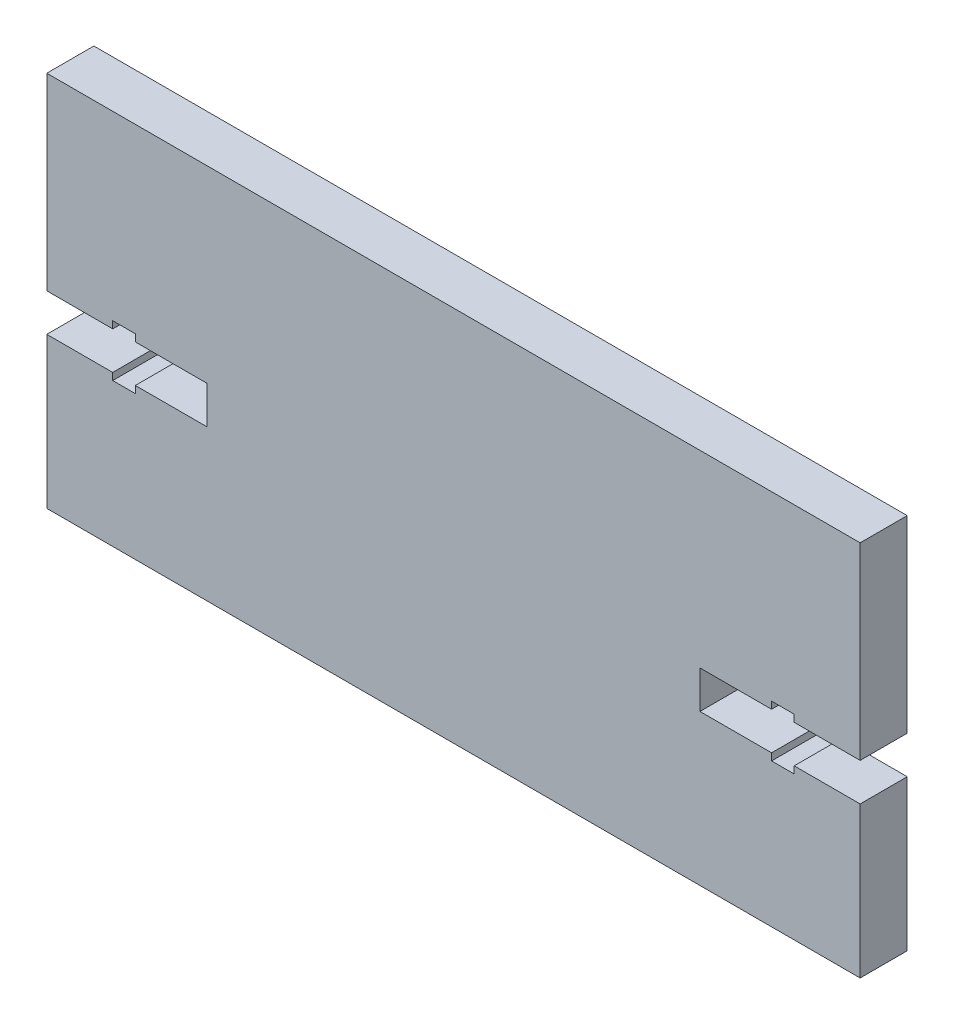
ISO-10303-21;
HEADER;
FILE_DESCRIPTION(('STEP AP214'),'2;1');
FILE_NAME('part.step','',(''),(''),'','','');
FILE_SCHEMA(('AUTOMOTIVE_DESIGN { 1 0 10303 214 1 1 1 1 }'));
ENDSEC;
DATA;
#1=APPLICATION_CONTEXT('core data for automotive mechanical design processes');
#2=APPLICATION_PROTOCOL_DEFINITION('international standard','automotive_design',2000,#1);
#3=PRODUCT_CONTEXT('',#1,'mechanical');
#4=PRODUCT('Part','Part','',(#3));
#5=PRODUCT_RELATED_PRODUCT_CATEGORY('part','',(#4));
#6=PRODUCT_DEFINITION_FORMATION('','',#4);
#7=PRODUCT_DEFINITION_CONTEXT('part definition',#1,'design');
#8=PRODUCT_DEFINITION('design','',#6,#7);
#9=PRODUCT_DEFINITION_SHAPE('','',#8);
#10=(LENGTH_UNIT() NAMED_UNIT(*) SI_UNIT(.MILLI.,.METRE.));
#11=(NAMED_UNIT(*) PLANE_ANGLE_UNIT() SI_UNIT($,.RADIAN.));
#12=(NAMED_UNIT(*) SI_UNIT($,.STERADIAN.) SOLID_ANGLE_UNIT());
#13=UNCERTAINTY_MEASURE_WITH_UNIT(LENGTH_MEASURE(1.E-05),#10,'distance_accuracy_value','');
#14=(GEOMETRIC_REPRESENTATION_CONTEXT(3) GLOBAL_UNCERTAINTY_ASSIGNED_CONTEXT((#13)) GLOBAL_UNIT_ASSIGNED_CONTEXT((#10,
#11,#12)) REPRESENTATION_CONTEXT('',''));
#15=CARTESIAN_POINT('',(0.,0.,0.));
#16=DIRECTION('',(0.,0.,1.));
#17=DIRECTION('',(1.,0.,0.));
#18=AXIS2_PLACEMENT_3D('',#15,#16,#17);
#19=CARTESIAN_POINT('',(-34.7185538966779,10.5285496749878,5.));
#20=DIRECTION('',(1.,0.,0.));
#21=DIRECTION('',(0.,1.,0.));
#22=AXIS2_PLACEMENT_3D('',#19,#20,#21);
#23=PLANE('',#22);
#24=DIRECTION('',(0.,-1.,0.));
#25=VECTOR('',#24,1.);
#26=CARTESIAN_POINT('',(-34.7185538966779,10.5285496749878,0.));
#27=LINE('',#26,#25);
#28=CARTESIAN_POINT('',(-34.7185538966779,10.5285496749878,0.));
#29=VERTEX_POINT('',#28);
#30=CARTESIAN_POINT('',(-34.7185538966779,-9.47145032501215,0.));
#31=VERTEX_POINT('',#30);
#32=EDGE_CURVE('E401',#29,#31,#27,.T.);
#33=ORIENTED_EDGE('',*,*,#32,.T.);
#34=DIRECTION('',(0.,0.,-1.));
#35=VECTOR('',#34,1.);
#36=CARTESIAN_POINT('',(-34.7185538966779,-9.47145032501215,10.));
#37=LINE('',#36,#35);
#38=CARTESIAN_POINT('',(-34.7185538966779,-9.47145032501215,5.));
#39=VERTEX_POINT('',#38);
#40=EDGE_CURVE('E236',#39,#31,#37,.T.);
#41=ORIENTED_EDGE('',*,*,#40,.F.);
#42=DIRECTION('',(0.,-1.,0.));
#43=VECTOR('',#42,1.);
#44=CARTESIAN_POINT('',(-34.7185538966779,10.5285496749878,5.));
#45=LINE('',#44,#43);
#46=CARTESIAN_POINT('',(-34.7185538966779,10.5285496749878,5.));
#47=VERTEX_POINT('',#46);
#48=EDGE_CURVE('E388',#47,#39,#45,.T.);
#49=ORIENTED_EDGE('',*,*,#48,.F.);
#50=DIRECTION('',(0.,0.,-1.));
#51=VECTOR('',#50,1.);
#52=CARTESIAN_POINT('',(-34.7185538966779,10.5285496749878,5.));
#53=LINE('',#52,#51);
#54=EDGE_CURVE('E400',#47,#29,#53,.T.);
#55=ORIENTED_EDGE('',*,*,#54,.T.);
#56=EDGE_LOOP('',(#33,#41,#49,#55));
#57=FACE_BOUND('',#56,.T.);
#58=ADVANCED_FACE('F33',(#57),#23,.F.);
#59=CARTESIAN_POINT('',(51.6079265333221,10.5285496749878,5.));
#60=DIRECTION('',(-1.,0.,0.));
#61=DIRECTION('',(0.,-1.,0.));
#62=AXIS2_PLACEMENT_3D('',#59,#60,#61);
#63=PLANE('',#62);
#64=DIRECTION('',(0.,1.,0.));
#65=VECTOR('',#64,1.);
#66=CARTESIAN_POINT('',(51.6079265333221,10.5285496749878,5.));
#67=LINE('',#66,#65);
#68=CARTESIAN_POINT('',(51.6079265333222,-9.47145032501216,5.));
#69=VERTEX_POINT('',#68);
#70=CARTESIAN_POINT('',(51.6079265333221,10.5285496749878,5.));
#71=VERTEX_POINT('',#70);
#72=EDGE_CURVE('E394',#69,#71,#67,.T.);
#73=ORIENTED_EDGE('',*,*,#72,.F.);
#74=DIRECTION('',(0.,0.,-1.));
#75=VECTOR('',#74,1.);
#76=CARTESIAN_POINT('',(51.6079265333222,-9.47145032501216,10.));
#77=LINE('',#76,#75);
#78=CARTESIAN_POINT('',(51.6079265333222,-9.47145032501216,0.));
#79=VERTEX_POINT('',#78);
#80=EDGE_CURVE('E269',#69,#79,#77,.T.);
#81=ORIENTED_EDGE('',*,*,#80,.T.);
#82=DIRECTION('',(0.,1.,0.));
#83=VECTOR('',#82,1.);
#84=CARTESIAN_POINT('',(51.6079265333221,10.5285496749878,0.));
#85=LINE('',#84,#83);
#86=CARTESIAN_POINT('',(51.6079265333221,10.5285496749878,0.));
#87=VERTEX_POINT('',#86);
#88=EDGE_CURVE('E406',#79,#87,#85,.T.);
#89=ORIENTED_EDGE('',*,*,#88,.T.);
#90=DIRECTION('',(0.,0.,-1.));
#91=VECTOR('',#90,1.);
#92=CARTESIAN_POINT('',(51.6079265333221,10.5285496749878,5.));
#93=LINE('',#92,#91);
#94=EDGE_CURVE('E413',#71,#87,#93,.T.);
#95=ORIENTED_EDGE('',*,*,#94,.F.);
#96=EDGE_LOOP('',(#73,#81,#89,#95));
#97=FACE_BOUND('',#96,.T.);
#98=ADVANCED_FACE('F495',(#97),#63,.F.);
#99=CARTESIAN_POINT('',(-34.7185538966779,-13.4714503250122,5.));
#100=VERTEX_POINT('',#99);
#101=CARTESIAN_POINT('',(-34.7185538966779,-29.4714503250121,5.));
#102=VERTEX_POINT('',#101);
#103=EDGE_CURVE('E392',#100,#102,#45,.T.);
#104=ORIENTED_EDGE('',*,*,#103,.F.);
#105=DIRECTION('',(0.,0.,-1.));
#106=VECTOR('',#105,1.);
#107=CARTESIAN_POINT('',(-34.7185538966779,-13.4714503250122,10.));
#108=LINE('',#107,#106);
#109=CARTESIAN_POINT('',(-34.7185538966779,-13.4714503250122,0.));
#110=VERTEX_POINT('',#109);
#111=EDGE_CURVE('E323',#100,#110,#108,.T.);
#112=ORIENTED_EDGE('',*,*,#111,.T.);
#113=CARTESIAN_POINT('',(-34.7185538966779,-29.4714503250121,0.));
#114=VERTEX_POINT('',#113);
#115=EDGE_CURVE('E387',#110,#114,#27,.T.);
#116=ORIENTED_EDGE('',*,*,#115,.T.);
#117=DIRECTION('',(0.,0.,-1.));
#118=VECTOR('',#117,1.);
#119=CARTESIAN_POINT('',(-34.7185538966779,-29.4714503250121,5.));
#120=LINE('',#119,#118);
#121=EDGE_CURVE('E11',#102,#114,#120,.T.);
#122=ORIENTED_EDGE('',*,*,#121,.F.);
#123=EDGE_LOOP('',(#104,#112,#116,#122));
#124=FACE_BOUND('',#123,.T.);
#125=ADVANCED_FACE('F35',(#124),#23,.F.);
#126=CARTESIAN_POINT('',(-34.7185538966779,-29.4714503250121,5.));
#127=DIRECTION('',(0.,1.,0.));
#128=DIRECTION('',(0.,0.,1.));
#129=AXIS2_PLACEMENT_3D('',#126,#127,#128);
#130=PLANE('',#129);
#131=DIRECTION('',(1.,0.,0.));
#132=VECTOR('',#131,1.);
#133=CARTESIAN_POINT('',(-34.7185538966779,-29.4714503250121,0.));
#134=LINE('',#133,#132);
#135=CARTESIAN_POINT('',(51.6079265333221,-29.4714503250121,0.));
#136=VERTEX_POINT('',#135);
#137=EDGE_CURVE('E404',#114,#136,#134,.T.);
#138=ORIENTED_EDGE('',*,*,#137,.T.);
#139=DIRECTION('',(0.,0.,-1.));
#140=VECTOR('',#139,1.);
#141=CARTESIAN_POINT('',(51.6079265333221,-29.4714503250121,5.));
#142=LINE('',#141,#140);
#143=CARTESIAN_POINT('',(51.6079265333221,-29.4714503250121,5.));
#144=VERTEX_POINT('',#143);
#145=EDGE_CURVE('E41',#144,#136,#142,.T.);
#146=ORIENTED_EDGE('',*,*,#145,.F.);
#147=DIRECTION('',(1.,0.,0.));
#148=VECTOR('',#147,1.);
#149=CARTESIAN_POINT('',(-34.7185538966779,-29.4714503250121,5.));
#150=LINE('',#149,#148);
#151=EDGE_CURVE('E391',#102,#144,#150,.T.);
#152=ORIENTED_EDGE('',*,*,#151,.F.);
#153=ORIENTED_EDGE('',*,*,#121,.T.);
#154=EDGE_LOOP('',(#138,#146,#152,#153));
#155=FACE_BOUND('',#154,.T.);
#156=ADVANCED_FACE('F426',(#155),#130,.F.);
#157=CARTESIAN_POINT('',(51.6079265333221,-13.4714503250122,0.));
#158=VERTEX_POINT('',#157);
#159=EDGE_CURVE('E407',#136,#158,#85,.T.);
#160=ORIENTED_EDGE('',*,*,#159,.T.);
#161=DIRECTION('',(0.,0.,-1.));
#162=VECTOR('',#161,1.);
#163=CARTESIAN_POINT('',(51.6079265333222,-13.4714503250122,10.));
#164=LINE('',#163,#162);
#165=CARTESIAN_POINT('',(51.6079265333222,-13.4714503250122,5.));
#166=VERTEX_POINT('',#165);
#167=EDGE_CURVE('E56',#166,#158,#164,.T.);
#168=ORIENTED_EDGE('',*,*,#167,.F.);
#169=EDGE_CURVE('E395',#144,#166,#67,.T.);
#170=ORIENTED_EDGE('',*,*,#169,.F.);
#171=ORIENTED_EDGE('',*,*,#145,.T.);
#172=EDGE_LOOP('',(#160,#168,#170,#171));
#173=FACE_BOUND('',#172,.T.);
#174=ADVANCED_FACE('F419',(#173),#63,.F.);
#175=CARTESIAN_POINT('',(-34.7185538966779,10.5285496749878,5.));
#176=DIRECTION('',(0.,-1.,0.));
#177=DIRECTION('',(0.,0.,-1.));
#178=AXIS2_PLACEMENT_3D('',#175,#176,#177);
#179=PLANE('',#178);
#180=DIRECTION('',(-1.,0.,0.));
#181=VECTOR('',#180,1.);
#182=CARTESIAN_POINT('',(-34.7185538966779,10.5285496749878,0.));
#183=LINE('',#182,#181);
#184=EDGE_CURVE('E409',#87,#29,#183,.T.);
#185=ORIENTED_EDGE('',*,*,#184,.T.);
#186=ORIENTED_EDGE('',*,*,#54,.F.);
#187=DIRECTION('',(-1.,0.,0.));
#188=VECTOR('',#187,1.);
#189=CARTESIAN_POINT('',(-34.7185538966779,10.5285496749878,5.));
#190=LINE('',#189,#188);
#191=EDGE_CURVE('E398',#71,#47,#190,.T.);
#192=ORIENTED_EDGE('',*,*,#191,.F.);
#193=ORIENTED_EDGE('',*,*,#94,.T.);
#194=EDGE_LOOP('',(#185,#186,#192,#193));
#195=FACE_BOUND('',#194,.T.);
#196=ADVANCED_FACE('F491',(#195),#179,.F.);
#197=CARTESIAN_POINT('',(0.,0.,5.));
#198=DIRECTION('',(0.,0.,1.));
#199=DIRECTION('',(1.,0.,0.));
#200=AXIS2_PLACEMENT_3D('',#197,#198,#199);
#201=PLANE('',#200);
#202=DIRECTION('',(-1.,0.,0.));
#203=VECTOR('',#202,1.);
#204=CARTESIAN_POINT('',(0.,-9.47145032501216,5.));
#205=LINE('',#204,#203);
#206=CARTESIAN_POINT('',(44.6079265333222,-9.47145032501216,5.));
#207=VERTEX_POINT('',#206);
#208=EDGE_CURVE('E385',#69,#207,#205,.T.);
#209=ORIENTED_EDGE('',*,*,#208,.F.);
#210=ORIENTED_EDGE('',*,*,#72,.T.);
#211=ORIENTED_EDGE('',*,*,#191,.T.);
#212=ORIENTED_EDGE('',*,*,#48,.T.);
#213=DIRECTION('',(-1.,0.,0.));
#214=VECTOR('',#213,1.);
#215=CARTESIAN_POINT('',(0.,-9.47145032501216,5.));
#216=LINE('',#215,#214);
#217=CARTESIAN_POINT('',(-27.7185538966779,-9.47145032501215,5.));
#218=VERTEX_POINT('',#217);
#219=EDGE_CURVE('E364',#218,#39,#216,.T.);
#220=ORIENTED_EDGE('',*,*,#219,.F.);
#221=DIRECTION('',(0.,-1.,0.));
#222=VECTOR('',#221,1.);
#223=CARTESIAN_POINT('',(-27.7185538966779,0.,5.));
#224=LINE('',#223,#222);
#225=CARTESIAN_POINT('',(-27.7185538966779,-8.72145032501215,5.));
#226=VERTEX_POINT('',#225);
#227=EDGE_CURVE('E272',#226,#218,#224,.T.);
#228=ORIENTED_EDGE('',*,*,#227,.F.);
#229=DIRECTION('',(-1.,0.,0.));
#230=VECTOR('',#229,1.);
#231=CARTESIAN_POINT('',(0.,-8.72145032501215,5.));
#232=LINE('',#231,#230);
#233=CARTESIAN_POINT('',(-25.3185538966779,-8.72145032501215,5.));
#234=VERTEX_POINT('',#233);
#235=EDGE_CURVE('E346',#234,#226,#232,.T.);
#236=ORIENTED_EDGE('',*,*,#235,.F.);
#237=DIRECTION('',(0.,1.,0.));
#238=VECTOR('',#237,1.);
#239=CARTESIAN_POINT('',(-25.3185538966779,0.,5.));
#240=LINE('',#239,#238);
#241=CARTESIAN_POINT('',(-25.3185538966779,-9.47145032501215,5.));
#242=VERTEX_POINT('',#241);
#243=EDGE_CURVE('E348',#242,#234,#240,.T.);
#244=ORIENTED_EDGE('',*,*,#243,.F.);
#245=DIRECTION('',(-1.,0.,0.));
#246=VECTOR('',#245,1.);
#247=CARTESIAN_POINT('',(0.,-9.47145032501215,5.));
#248=LINE('',#247,#246);
#249=CARTESIAN_POINT('',(-17.718553896678,-9.47145032501215,5.));
#250=VERTEX_POINT('',#249);
#251=EDGE_CURVE('E350',#250,#242,#248,.T.);
#252=ORIENTED_EDGE('',*,*,#251,.F.);
#253=DIRECTION('',(0.,1.,0.));
#254=VECTOR('',#253,1.);
#255=CARTESIAN_POINT('',(-17.718553896678,0.,5.));
#256=LINE('',#255,#254);
#257=CARTESIAN_POINT('',(-17.718553896678,-13.4714503250122,5.));
#258=VERTEX_POINT('',#257);
#259=EDGE_CURVE('E352',#258,#250,#256,.T.);
#260=ORIENTED_EDGE('',*,*,#259,.F.);
#261=DIRECTION('',(1.,0.,0.));
#262=VECTOR('',#261,1.);
#263=CARTESIAN_POINT('',(0.,-13.4714503250122,5.));
#264=LINE('',#263,#262);
#265=CARTESIAN_POINT('',(-25.318553896678,-13.4714503250122,5.));
#266=VERTEX_POINT('',#265);
#267=EDGE_CURVE('E354',#266,#258,#264,.T.);
#268=ORIENTED_EDGE('',*,*,#267,.F.);
#269=DIRECTION('',(0.,1.,0.));
#270=VECTOR('',#269,1.);
#271=CARTESIAN_POINT('',(-25.318553896678,0.,5.));
#272=LINE('',#271,#270);
#273=CARTESIAN_POINT('',(-25.318553896678,-14.2214503250122,5.));
#274=VERTEX_POINT('',#273);
#275=EDGE_CURVE('E356',#274,#266,#272,.T.);
#276=ORIENTED_EDGE('',*,*,#275,.F.);
#277=DIRECTION('',(1.,0.,0.));
#278=VECTOR('',#277,1.);
#279=CARTESIAN_POINT('',(0.,-14.2214503250122,5.));
#280=LINE('',#279,#278);
#281=CARTESIAN_POINT('',(-27.718553896678,-14.2214503250122,5.));
#282=VERTEX_POINT('',#281);
#283=EDGE_CURVE('E358',#282,#274,#280,.T.);
#284=ORIENTED_EDGE('',*,*,#283,.F.);
#285=DIRECTION('',(0.,-1.,0.));
#286=VECTOR('',#285,1.);
#287=CARTESIAN_POINT('',(-27.718553896678,0.,5.));
#288=LINE('',#287,#286);
#289=CARTESIAN_POINT('',(-27.718553896678,-13.4714503250122,5.));
#290=VERTEX_POINT('',#289);
#291=EDGE_CURVE('E360',#290,#282,#288,.T.);
#292=ORIENTED_EDGE('',*,*,#291,.F.);
#293=DIRECTION('',(1.,0.,0.));
#294=VECTOR('',#293,1.);
#295=CARTESIAN_POINT('',(0.,-13.4714503250122,5.));
#296=LINE('',#295,#294);
#297=EDGE_CURVE('E362',#100,#290,#296,.T.);
#298=ORIENTED_EDGE('',*,*,#297,.F.);
#299=ORIENTED_EDGE('',*,*,#103,.T.);
#300=ORIENTED_EDGE('',*,*,#151,.T.);
#301=ORIENTED_EDGE('',*,*,#169,.T.);
#302=DIRECTION('',(1.,0.,0.));
#303=VECTOR('',#302,1.);
#304=CARTESIAN_POINT('',(0.,-13.4714503250122,5.));
#305=LINE('',#304,#303);
#306=CARTESIAN_POINT('',(44.6079265333222,-13.4714503250122,5.));
#307=VERTEX_POINT('',#306);
#308=EDGE_CURVE('E366',#307,#166,#305,.T.);
#309=ORIENTED_EDGE('',*,*,#308,.F.);
#310=DIRECTION('',(0.,1.,0.));
#311=VECTOR('',#310,1.);
#312=CARTESIAN_POINT('',(44.6079265333222,0.,5.));
#313=LINE('',#312,#311);
#314=CARTESIAN_POINT('',(44.6079265333222,-14.2214503250122,5.));
#315=VERTEX_POINT('',#314);
#316=EDGE_CURVE('E227',#315,#307,#313,.T.);
#317=ORIENTED_EDGE('',*,*,#316,.F.);
#318=DIRECTION('',(1.,0.,0.));
#319=VECTOR('',#318,1.);
#320=CARTESIAN_POINT('',(0.,-14.2214503250122,5.));
#321=LINE('',#320,#319);
#322=CARTESIAN_POINT('',(42.2079265333222,-14.2214503250122,5.));
#323=VERTEX_POINT('',#322);
#324=EDGE_CURVE('E369',#323,#315,#321,.T.);
#325=ORIENTED_EDGE('',*,*,#324,.F.);
#326=DIRECTION('',(0.,-1.,0.));
#327=VECTOR('',#326,1.);
#328=CARTESIAN_POINT('',(42.2079265333222,0.,5.));
#329=LINE('',#328,#327);
#330=CARTESIAN_POINT('',(42.2079265333222,-13.4714503250122,5.));
#331=VERTEX_POINT('',#330);
#332=EDGE_CURVE('E371',#331,#323,#329,.T.);
#333=ORIENTED_EDGE('',*,*,#332,.F.);
#334=DIRECTION('',(1.,0.,0.));
#335=VECTOR('',#334,1.);
#336=CARTESIAN_POINT('',(0.,-13.4714503250122,5.));
#337=LINE('',#336,#335);
#338=CARTESIAN_POINT('',(34.6079265333222,-13.4714503250122,5.));
#339=VERTEX_POINT('',#338);
#340=EDGE_CURVE('E373',#339,#331,#337,.T.);
#341=ORIENTED_EDGE('',*,*,#340,.F.);
#342=DIRECTION('',(0.,-1.,0.));
#343=VECTOR('',#342,1.);
#344=CARTESIAN_POINT('',(34.6079265333222,0.,5.));
#345=LINE('',#344,#343);
#346=CARTESIAN_POINT('',(34.6079265333222,-9.47145032501216,5.));
#347=VERTEX_POINT('',#346);
#348=EDGE_CURVE('E375',#347,#339,#345,.T.);
#349=ORIENTED_EDGE('',*,*,#348,.F.);
#350=DIRECTION('',(-1.,0.,0.));
#351=VECTOR('',#350,1.);
#352=CARTESIAN_POINT('',(0.,-9.47145032501215,5.));
#353=LINE('',#352,#351);
#354=CARTESIAN_POINT('',(42.2079265333222,-9.47145032501216,5.));
#355=VERTEX_POINT('',#354);
#356=EDGE_CURVE('E377',#355,#347,#353,.T.);
#357=ORIENTED_EDGE('',*,*,#356,.F.);
#358=DIRECTION('',(0.,-1.,0.));
#359=VECTOR('',#358,1.);
#360=CARTESIAN_POINT('',(42.2079265333222,0.,5.));
#361=LINE('',#360,#359);
#362=CARTESIAN_POINT('',(42.2079265333222,-8.72145032501216,5.));
#363=VERTEX_POINT('',#362);
#364=EDGE_CURVE('E379',#363,#355,#361,.T.);
#365=ORIENTED_EDGE('',*,*,#364,.F.);
#366=DIRECTION('',(-1.,0.,0.));
#367=VECTOR('',#366,1.);
#368=CARTESIAN_POINT('',(0.,-8.72145032501216,5.));
#369=LINE('',#368,#367);
#370=CARTESIAN_POINT('',(44.6079265333222,-8.72145032501216,5.));
#371=VERTEX_POINT('',#370);
#372=EDGE_CURVE('E381',#371,#363,#369,.T.);
#373=ORIENTED_EDGE('',*,*,#372,.F.);
#374=DIRECTION('',(0.,1.,0.));
#375=VECTOR('',#374,1.);
#376=CARTESIAN_POINT('',(44.6079265333222,0.,5.));
#377=LINE('',#376,#375);
#378=EDGE_CURVE('E383',#207,#371,#377,.T.);
#379=ORIENTED_EDGE('',*,*,#378,.F.);
#380=EDGE_LOOP('',(#209,#210,#211,#212,#220,#228,#236,#244,#252,#260,#268,#276,#284,#292,#298,
#299,#300,#301,#309,#317,#325,#333,#341,#349,#357,#365,#373,#379));
#381=FACE_BOUND('',#380,.T.);
#382=ADVANCED_FACE('F436',(#381),#201,.T.);
#383=CARTESIAN_POINT('',(0.,0.,0.));
#384=DIRECTION('',(0.,0.,1.));
#385=DIRECTION('',(1.,0.,0.));
#386=AXIS2_PLACEMENT_3D('',#383,#384,#385);
#387=PLANE('',#386);
#388=ORIENTED_EDGE('',*,*,#88,.F.);
#389=DIRECTION('',(1.,0.,0.));
#390=VECTOR('',#389,1.);
#391=CARTESIAN_POINT('',(51.6079265333222,-9.47145032501216,0.));
#392=LINE('',#391,#390);
#393=CARTESIAN_POINT('',(44.6079265333222,-9.47145032501216,0.));
#394=VERTEX_POINT('',#393);
#395=EDGE_CURVE('E267',#394,#79,#392,.T.);
#396=ORIENTED_EDGE('',*,*,#395,.F.);
#397=DIRECTION('',(0.,-1.,0.));
#398=VECTOR('',#397,1.);
#399=CARTESIAN_POINT('',(44.6079265333222,-9.47145032501216,0.));
#400=LINE('',#399,#398);
#401=CARTESIAN_POINT('',(44.6079265333222,-8.72145032501216,0.));
#402=VERTEX_POINT('',#401);
#403=EDGE_CURVE('E264',#402,#394,#400,.T.);
#404=ORIENTED_EDGE('',*,*,#403,.F.);
#405=DIRECTION('',(1.,0.,0.));
#406=VECTOR('',#405,1.);
#407=CARTESIAN_POINT('',(44.6079265333222,-8.72145032501216,0.));
#408=LINE('',#407,#406);
#409=CARTESIAN_POINT('',(42.2079265333222,-8.72145032501216,0.));
#410=VERTEX_POINT('',#409);
#411=EDGE_CURVE('E261',#410,#402,#408,.T.);
#412=ORIENTED_EDGE('',*,*,#411,.F.);
#413=DIRECTION('',(0.,1.,0.));
#414=VECTOR('',#413,1.);
#415=CARTESIAN_POINT('',(42.2079265333222,-8.72145032501216,0.));
#416=LINE('',#415,#414);
#417=CARTESIAN_POINT('',(42.2079265333222,-9.47145032501216,0.));
#418=VERTEX_POINT('',#417);
#419=EDGE_CURVE('E258',#418,#410,#416,.T.);
#420=ORIENTED_EDGE('',*,*,#419,.F.);
#421=DIRECTION('',(1.,0.,0.));
#422=VECTOR('',#421,1.);
#423=CARTESIAN_POINT('',(42.2079265333222,-9.47145032501216,0.));
#424=LINE('',#423,#422);
#425=CARTESIAN_POINT('',(34.6079265333222,-9.47145032501216,0.));
#426=VERTEX_POINT('',#425);
#427=EDGE_CURVE('E255',#426,#418,#424,.T.);
#428=ORIENTED_EDGE('',*,*,#427,.F.);
#429=DIRECTION('',(0.,1.,0.));
#430=VECTOR('',#429,1.);
#431=CARTESIAN_POINT('',(34.6079265333222,-9.47145032501216,0.));
#432=LINE('',#431,#430);
#433=CARTESIAN_POINT('',(34.6079265333222,-13.4714503250122,0.));
#434=VERTEX_POINT('',#433);
#435=EDGE_CURVE('E252',#434,#426,#432,.T.);
#436=ORIENTED_EDGE('',*,*,#435,.F.);
#437=DIRECTION('',(-1.,0.,0.));
#438=VECTOR('',#437,1.);
#439=CARTESIAN_POINT('',(34.6079265333222,-13.4714503250122,0.));
#440=LINE('',#439,#438);
#441=CARTESIAN_POINT('',(42.2079265333222,-13.4714503250122,0.));
#442=VERTEX_POINT('',#441);
#443=EDGE_CURVE('E249',#442,#434,#440,.T.);
#444=ORIENTED_EDGE('',*,*,#443,.F.);
#445=DIRECTION('',(0.,1.,0.));
#446=VECTOR('',#445,1.);
#447=CARTESIAN_POINT('',(42.2079265333222,-13.4714503250122,0.));
#448=LINE('',#447,#446);
#449=CARTESIAN_POINT('',(42.2079265333222,-14.2214503250122,0.));
#450=VERTEX_POINT('',#449);
#451=EDGE_CURVE('E244',#450,#442,#448,.T.);
#452=ORIENTED_EDGE('',*,*,#451,.F.);
#453=DIRECTION('',(-1.,0.,0.));
#454=VECTOR('',#453,1.);
#455=CARTESIAN_POINT('',(42.2079265333222,-14.2214503250122,0.));
#456=LINE('',#455,#454);
#457=CARTESIAN_POINT('',(44.6079265333222,-14.2214503250122,0.));
#458=VERTEX_POINT('',#457);
#459=EDGE_CURVE('E242',#458,#450,#456,.T.);
#460=ORIENTED_EDGE('',*,*,#459,.F.);
#461=DIRECTION('',(0.,-1.,0.));
#462=VECTOR('',#461,1.);
#463=CARTESIAN_POINT('',(44.6079265333222,-14.2214503250122,0.));
#464=LINE('',#463,#462);
#465=CARTESIAN_POINT('',(44.6079265333222,-13.4714503250122,0.));
#466=VERTEX_POINT('',#465);
#467=EDGE_CURVE('E224',#466,#458,#464,.T.);
#468=ORIENTED_EDGE('',*,*,#467,.F.);
#469=DIRECTION('',(-1.,0.,0.));
#470=VECTOR('',#469,1.);
#471=CARTESIAN_POINT('',(44.6079265333222,-13.4714503250122,0.));
#472=LINE('',#471,#470);
#473=EDGE_CURVE('E231',#158,#466,#472,.T.);
#474=ORIENTED_EDGE('',*,*,#473,.F.);
#475=ORIENTED_EDGE('',*,*,#159,.F.);
#476=ORIENTED_EDGE('',*,*,#137,.F.);
#477=ORIENTED_EDGE('',*,*,#115,.F.);
#478=DIRECTION('',(-1.,0.,0.));
#479=VECTOR('',#478,1.);
#480=CARTESIAN_POINT('',(-27.718553896678,-13.4714503250122,0.));
#481=LINE('',#480,#479);
#482=CARTESIAN_POINT('',(-27.718553896678,-13.4714503250122,0.));
#483=VERTEX_POINT('',#482);
#484=EDGE_CURVE('E319',#483,#110,#481,.T.);
#485=ORIENTED_EDGE('',*,*,#484,.F.);
#486=DIRECTION('',(0.,1.,0.));
#487=VECTOR('',#486,1.);
#488=CARTESIAN_POINT('',(-27.718553896678,-14.2214503250122,0.));
#489=LINE('',#488,#487);
#490=CARTESIAN_POINT('',(-27.718553896678,-14.2214503250122,0.));
#491=VERTEX_POINT('',#490);
#492=EDGE_CURVE('E316',#491,#483,#489,.T.);
#493=ORIENTED_EDGE('',*,*,#492,.F.);
#494=DIRECTION('',(-1.,0.,0.));
#495=VECTOR('',#494,1.);
#496=CARTESIAN_POINT('',(-25.318553896678,-14.2214503250122,0.));
#497=LINE('',#496,#495);
#498=CARTESIAN_POINT('',(-25.318553896678,-14.2214503250122,0.));
#499=VERTEX_POINT('',#498);
#500=EDGE_CURVE('E313',#499,#491,#497,.T.);
#501=ORIENTED_EDGE('',*,*,#500,.F.);
#502=DIRECTION('',(0.,-1.,0.));
#503=VECTOR('',#502,1.);
#504=CARTESIAN_POINT('',(-25.318553896678,-13.4714503250122,0.));
#505=LINE('',#504,#503);
#506=CARTESIAN_POINT('',(-25.318553896678,-13.4714503250122,0.));
#507=VERTEX_POINT('',#506);
#508=EDGE_CURVE('E310',#507,#499,#505,.T.);
#509=ORIENTED_EDGE('',*,*,#508,.F.);
#510=DIRECTION('',(-1.,0.,0.));
#511=VECTOR('',#510,1.);
#512=CARTESIAN_POINT('',(-17.718553896678,-13.4714503250122,0.));
#513=LINE('',#512,#511);
#514=CARTESIAN_POINT('',(-17.718553896678,-13.4714503250122,0.));
#515=VERTEX_POINT('',#514);
#516=EDGE_CURVE('E307',#515,#507,#513,.T.);
#517=ORIENTED_EDGE('',*,*,#516,.F.);
#518=DIRECTION('',(0.,-1.,0.));
#519=VECTOR('',#518,1.);
#520=CARTESIAN_POINT('',(-17.718553896678,-9.47145032501215,0.));
#521=LINE('',#520,#519);
#522=CARTESIAN_POINT('',(-17.718553896678,-9.47145032501215,0.));
#523=VERTEX_POINT('',#522);
#524=EDGE_CURVE('E304',#523,#515,#521,.T.);
#525=ORIENTED_EDGE('',*,*,#524,.F.);
#526=DIRECTION('',(1.,0.,0.));
#527=VECTOR('',#526,1.);
#528=CARTESIAN_POINT('',(-25.3185538966779,-9.47145032501215,0.));
#529=LINE('',#528,#527);
#530=CARTESIAN_POINT('',(-25.3185538966779,-9.47145032501215,0.));
#531=VERTEX_POINT('',#530);
#532=EDGE_CURVE('E301',#531,#523,#529,.T.);
#533=ORIENTED_EDGE('',*,*,#532,.F.);
#534=DIRECTION('',(0.,-1.,0.));
#535=VECTOR('',#534,1.);
#536=CARTESIAN_POINT('',(-25.3185538966779,-8.72145032501215,0.));
#537=LINE('',#536,#535);
#538=CARTESIAN_POINT('',(-25.3185538966779,-8.72145032501215,0.));
#539=VERTEX_POINT('',#538);
#540=EDGE_CURVE('E298',#539,#531,#537,.T.);
#541=ORIENTED_EDGE('',*,*,#540,.F.);
#542=DIRECTION('',(1.,0.,0.));
#543=VECTOR('',#542,1.);
#544=CARTESIAN_POINT('',(-27.7185538966779,-8.72145032501215,0.));
#545=LINE('',#544,#543);
#546=CARTESIAN_POINT('',(-27.7185538966779,-8.72145032501215,0.));
#547=VERTEX_POINT('',#546);
#548=EDGE_CURVE('E295',#547,#539,#545,.T.);
#549=ORIENTED_EDGE('',*,*,#548,.F.);
#550=DIRECTION('',(0.,1.,0.));
#551=VECTOR('',#550,1.);
#552=CARTESIAN_POINT('',(-27.7185538966779,-9.47145032501215,0.));
#553=LINE('',#552,#551);
#554=CARTESIAN_POINT('',(-27.7185538966779,-9.47145032501215,0.));
#555=VERTEX_POINT('',#554);
#556=EDGE_CURVE('E292',#555,#547,#553,.T.);
#557=ORIENTED_EDGE('',*,*,#556,.F.);
#558=DIRECTION('',(1.,0.,0.));
#559=VECTOR('',#558,1.);
#560=CARTESIAN_POINT('',(-34.7185538966779,-9.47145032501215,0.));
#561=LINE('',#560,#559);
#562=EDGE_CURVE('E48',#31,#555,#561,.T.);
#563=ORIENTED_EDGE('',*,*,#562,.F.);
#564=ORIENTED_EDGE('',*,*,#32,.F.);
#565=ORIENTED_EDGE('',*,*,#184,.F.);
#566=EDGE_LOOP('',(#388,#396,#404,#412,#420,#428,#436,#444,#452,#460,#468,#474,#475,#476,#477,
#485,#493,#501,#509,#517,#525,#533,#541,#549,#557,#563,#564,#565));
#567=FACE_BOUND('',#566,.T.);
#568=ADVANCED_FACE('F239',(#567),#387,.F.);
#569=CARTESIAN_POINT('',(-34.7185538966779,-9.47145032501215,10.));
#570=DIRECTION('',(0.,1.,0.));
#571=DIRECTION('',(-1.,0.,0.));
#572=AXIS2_PLACEMENT_3D('',#569,#570,#571);
#573=PLANE('',#572);
#574=ORIENTED_EDGE('',*,*,#219,.T.);
#575=ORIENTED_EDGE('',*,*,#40,.T.);
#576=ORIENTED_EDGE('',*,*,#562,.T.);
#577=DIRECTION('',(0.,0.,-1.));
#578=VECTOR('',#577,1.);
#579=CARTESIAN_POINT('',(-27.7185538966779,-9.47145032501215,10.));
#580=LINE('',#579,#578);
#581=EDGE_CURVE('E321',#218,#555,#580,.T.);
#582=ORIENTED_EDGE('',*,*,#581,.F.);
#583=EDGE_LOOP('',(#574,#575,#576,#582));
#584=FACE_BOUND('',#583,.T.);
#585=ADVANCED_FACE('F482',(#584),#573,.F.);
#586=CARTESIAN_POINT('',(-27.718553896678,-13.4714503250122,10.));
#587=DIRECTION('',(0.,-1.,0.));
#588=DIRECTION('',(0.,0.,-1.));
#589=AXIS2_PLACEMENT_3D('',#586,#587,#588);
#590=PLANE('',#589);
#591=ORIENTED_EDGE('',*,*,#297,.T.);
#592=DIRECTION('',(0.,0.,-1.));
#593=VECTOR('',#592,1.);
#594=CARTESIAN_POINT('',(-27.718553896678,-13.4714503250122,10.));
#595=LINE('',#594,#593);
#596=EDGE_CURVE('E326',#290,#483,#595,.T.);
#597=ORIENTED_EDGE('',*,*,#596,.T.);
#598=ORIENTED_EDGE('',*,*,#484,.T.);
#599=ORIENTED_EDGE('',*,*,#111,.F.);
#600=EDGE_LOOP('',(#591,#597,#598,#599));
#601=FACE_BOUND('',#600,.T.);
#602=ADVANCED_FACE('F431',(#601),#590,.F.);
#603=CARTESIAN_POINT('',(-27.718553896678,-14.2214503250122,10.));
#604=DIRECTION('',(-1.,0.,0.));
#605=DIRECTION('',(0.,0.,1.));
#606=AXIS2_PLACEMENT_3D('',#603,#604,#605);
#607=PLANE('',#606);
#608=ORIENTED_EDGE('',*,*,#291,.T.);
#609=DIRECTION('',(0.,0.,-1.));
#610=VECTOR('',#609,1.);
#611=CARTESIAN_POINT('',(-27.718553896678,-14.2214503250122,10.));
#612=LINE('',#611,#610);
#613=EDGE_CURVE('E328',#282,#491,#612,.T.);
#614=ORIENTED_EDGE('',*,*,#613,.T.);
#615=ORIENTED_EDGE('',*,*,#492,.T.);
#616=ORIENTED_EDGE('',*,*,#596,.F.);
#617=EDGE_LOOP('',(#608,#614,#615,#616));
#618=FACE_BOUND('',#617,.T.);
#619=ADVANCED_FACE('F441',(#618),#607,.F.);
#620=CARTESIAN_POINT('',(-25.318553896678,-14.2214503250122,10.));
#621=DIRECTION('',(0.,-1.,0.));
#622=DIRECTION('',(0.,0.,-1.));
#623=AXIS2_PLACEMENT_3D('',#620,#621,#622);
#624=PLANE('',#623);
#625=ORIENTED_EDGE('',*,*,#283,.T.);
#626=DIRECTION('',(0.,0.,-1.));
#627=VECTOR('',#626,1.);
#628=CARTESIAN_POINT('',(-25.318553896678,-14.2214503250122,10.));
#629=LINE('',#628,#627);
#630=EDGE_CURVE('E330',#274,#499,#629,.T.);
#631=ORIENTED_EDGE('',*,*,#630,.T.);
#632=ORIENTED_EDGE('',*,*,#500,.T.);
#633=ORIENTED_EDGE('',*,*,#613,.F.);
#634=EDGE_LOOP('',(#625,#631,#632,#633));
#635=FACE_BOUND('',#634,.T.);
#636=ADVANCED_FACE('F443',(#635),#624,.F.);
#637=CARTESIAN_POINT('',(-25.318553896678,-13.4714503250122,10.));
#638=DIRECTION('',(1.,0.,0.));
#639=DIRECTION('',(0.,0.,-1.));
#640=AXIS2_PLACEMENT_3D('',#637,#638,#639);
#641=PLANE('',#640);
#642=ORIENTED_EDGE('',*,*,#275,.T.);
#643=DIRECTION('',(0.,0.,-1.));
#644=VECTOR('',#643,1.);
#645=CARTESIAN_POINT('',(-25.318553896678,-13.4714503250122,10.));
#646=LINE('',#645,#644);
#647=EDGE_CURVE('E332',#266,#507,#646,.T.);
#648=ORIENTED_EDGE('',*,*,#647,.T.);
#649=ORIENTED_EDGE('',*,*,#508,.T.);
#650=ORIENTED_EDGE('',*,*,#630,.F.);
#651=EDGE_LOOP('',(#642,#648,#649,#650));
#652=FACE_BOUND('',#651,.T.);
#653=ADVANCED_FACE('F451',(#652),#641,.F.);
#654=CARTESIAN_POINT('',(-17.718553896678,-13.4714503250122,10.));
#655=DIRECTION('',(0.,-1.,0.));
#656=DIRECTION('',(0.,0.,-1.));
#657=AXIS2_PLACEMENT_3D('',#654,#655,#656);
#658=PLANE('',#657);
#659=ORIENTED_EDGE('',*,*,#267,.T.);
#660=DIRECTION('',(0.,0.,-1.));
#661=VECTOR('',#660,1.);
#662=CARTESIAN_POINT('',(-17.718553896678,-13.4714503250122,10.));
#663=LINE('',#662,#661);
#664=EDGE_CURVE('E334',#258,#515,#663,.T.);
#665=ORIENTED_EDGE('',*,*,#664,.T.);
#666=ORIENTED_EDGE('',*,*,#516,.T.);
#667=ORIENTED_EDGE('',*,*,#647,.F.);
#668=EDGE_LOOP('',(#659,#665,#666,#667));
#669=FACE_BOUND('',#668,.T.);
#670=ADVANCED_FACE('F455',(#669),#658,.F.);
#671=CARTESIAN_POINT('',(-17.718553896678,-9.47145032501215,10.));
#672=DIRECTION('',(1.,0.,0.));
#673=DIRECTION('',(0.,0.,-1.));
#674=AXIS2_PLACEMENT_3D('',#671,#672,#673);
#675=PLANE('',#674);
#676=ORIENTED_EDGE('',*,*,#259,.T.);
#677=DIRECTION('',(0.,0.,-1.));
#678=VECTOR('',#677,1.);
#679=CARTESIAN_POINT('',(-17.718553896678,-9.47145032501215,10.));
#680=LINE('',#679,#678);
#681=EDGE_CURVE('E336',#250,#523,#680,.T.);
#682=ORIENTED_EDGE('',*,*,#681,.T.);
#683=ORIENTED_EDGE('',*,*,#524,.T.);
#684=ORIENTED_EDGE('',*,*,#664,.F.);
#685=EDGE_LOOP('',(#676,#682,#683,#684));
#686=FACE_BOUND('',#685,.T.);
#687=ADVANCED_FACE('F459',(#686),#675,.F.);
#688=CARTESIAN_POINT('',(-25.3185538966779,-9.47145032501215,10.));
#689=DIRECTION('',(0.,1.,0.));
#690=DIRECTION('',(0.,0.,1.));
#691=AXIS2_PLACEMENT_3D('',#688,#689,#690);
#692=PLANE('',#691);
#693=ORIENTED_EDGE('',*,*,#251,.T.);
#694=DIRECTION('',(0.,0.,-1.));
#695=VECTOR('',#694,1.);
#696=CARTESIAN_POINT('',(-25.3185538966779,-9.47145032501215,10.));
#697=LINE('',#696,#695);
#698=EDGE_CURVE('E338',#242,#531,#697,.T.);
#699=ORIENTED_EDGE('',*,*,#698,.T.);
#700=ORIENTED_EDGE('',*,*,#532,.T.);
#701=ORIENTED_EDGE('',*,*,#681,.F.);
#702=EDGE_LOOP('',(#693,#699,#700,#701));
#703=FACE_BOUND('',#702,.T.);
#704=ADVANCED_FACE('F465',(#703),#692,.F.);
#705=CARTESIAN_POINT('',(-25.3185538966779,-8.72145032501215,10.));
#706=DIRECTION('',(1.,0.,0.));
#707=DIRECTION('',(0.,0.,-1.));
#708=AXIS2_PLACEMENT_3D('',#705,#706,#707);
#709=PLANE('',#708);
#710=ORIENTED_EDGE('',*,*,#243,.T.);
#711=DIRECTION('',(0.,0.,-1.));
#712=VECTOR('',#711,1.);
#713=CARTESIAN_POINT('',(-25.3185538966779,-8.72145032501215,10.));
#714=LINE('',#713,#712);
#715=EDGE_CURVE('E340',#234,#539,#714,.T.);
#716=ORIENTED_EDGE('',*,*,#715,.T.);
#717=ORIENTED_EDGE('',*,*,#540,.T.);
#718=ORIENTED_EDGE('',*,*,#698,.F.);
#719=EDGE_LOOP('',(#710,#716,#717,#718));
#720=FACE_BOUND('',#719,.T.);
#721=ADVANCED_FACE('F470',(#720),#709,.F.);
#722=CARTESIAN_POINT('',(-27.7185538966779,-8.72145032501215,10.));
#723=DIRECTION('',(0.,1.,0.));
#724=DIRECTION('',(0.,0.,1.));
#725=AXIS2_PLACEMENT_3D('',#722,#723,#724);
#726=PLANE('',#725);
#727=ORIENTED_EDGE('',*,*,#235,.T.);
#728=DIRECTION('',(0.,0.,-1.));
#729=VECTOR('',#728,1.);
#730=CARTESIAN_POINT('',(-27.7185538966779,-8.72145032501215,10.));
#731=LINE('',#730,#729);
#732=EDGE_CURVE('E342',#226,#547,#731,.T.);
#733=ORIENTED_EDGE('',*,*,#732,.T.);
#734=ORIENTED_EDGE('',*,*,#548,.T.);
#735=ORIENTED_EDGE('',*,*,#715,.F.);
#736=EDGE_LOOP('',(#727,#733,#734,#735));
#737=FACE_BOUND('',#736,.T.);
#738=ADVANCED_FACE('F474',(#737),#726,.F.);
#739=CARTESIAN_POINT('',(-27.7185538966779,-9.47145032501215,10.));
#740=DIRECTION('',(-1.,0.,0.));
#741=DIRECTION('',(0.,0.,1.));
#742=AXIS2_PLACEMENT_3D('',#739,#740,#741);
#743=PLANE('',#742);
#744=ORIENTED_EDGE('',*,*,#227,.T.);
#745=ORIENTED_EDGE('',*,*,#581,.T.);
#746=ORIENTED_EDGE('',*,*,#556,.T.);
#747=ORIENTED_EDGE('',*,*,#732,.F.);
#748=EDGE_LOOP('',(#744,#745,#746,#747));
#749=FACE_BOUND('',#748,.T.);
#750=ADVANCED_FACE('F479',(#749),#743,.F.);
#751=CARTESIAN_POINT('',(51.6079265333222,-9.47145032501216,10.));
#752=DIRECTION('',(0.,1.,0.));
#753=DIRECTION('',(0.,0.,1.));
#754=AXIS2_PLACEMENT_3D('',#751,#752,#753);
#755=PLANE('',#754);
#756=ORIENTED_EDGE('',*,*,#208,.T.);
#757=DIRECTION('',(0.,0.,-1.));
#758=VECTOR('',#757,1.);
#759=CARTESIAN_POINT('',(44.6079265333222,-9.47145032501216,10.));
#760=LINE('',#759,#758);
#761=EDGE_CURVE('E273',#207,#394,#760,.T.);
#762=ORIENTED_EDGE('',*,*,#761,.T.);
#763=ORIENTED_EDGE('',*,*,#395,.T.);
#764=ORIENTED_EDGE('',*,*,#80,.F.);
#765=EDGE_LOOP('',(#756,#762,#763,#764));
#766=FACE_BOUND('',#765,.T.);
#767=ADVANCED_FACE('F497',(#766),#755,.F.);
#768=CARTESIAN_POINT('',(44.6079265333222,-9.47145032501216,10.));
#769=DIRECTION('',(1.,0.,0.));
#770=DIRECTION('',(0.,0.,-1.));
#771=AXIS2_PLACEMENT_3D('',#768,#769,#770);
#772=PLANE('',#771);
#773=ORIENTED_EDGE('',*,*,#378,.T.);
#774=DIRECTION('',(0.,0.,-1.));
#775=VECTOR('',#774,1.);
#776=CARTESIAN_POINT('',(44.6079265333222,-8.72145032501216,10.));
#777=LINE('',#776,#775);
#778=EDGE_CURVE('E275',#371,#402,#777,.T.);
#779=ORIENTED_EDGE('',*,*,#778,.T.);
#780=ORIENTED_EDGE('',*,*,#403,.T.);
#781=ORIENTED_EDGE('',*,*,#761,.F.);
#782=EDGE_LOOP('',(#773,#779,#780,#781));
#783=FACE_BOUND('',#782,.T.);
#784=ADVANCED_FACE('F504',(#783),#772,.F.);
#785=CARTESIAN_POINT('',(44.6079265333222,-8.72145032501216,10.));
#786=DIRECTION('',(0.,1.,0.));
#787=DIRECTION('',(0.,0.,1.));
#788=AXIS2_PLACEMENT_3D('',#785,#786,#787);
#789=PLANE('',#788);
#790=ORIENTED_EDGE('',*,*,#372,.T.);
#791=DIRECTION('',(0.,0.,-1.));
#792=VECTOR('',#791,1.);
#793=CARTESIAN_POINT('',(42.2079265333222,-8.72145032501216,10.));
#794=LINE('',#793,#792);
#795=EDGE_CURVE('E277',#363,#410,#794,.T.);
#796=ORIENTED_EDGE('',*,*,#795,.T.);
#797=ORIENTED_EDGE('',*,*,#411,.T.);
#798=ORIENTED_EDGE('',*,*,#778,.F.);
#799=EDGE_LOOP('',(#790,#796,#797,#798));
#800=FACE_BOUND('',#799,.T.);
#801=ADVANCED_FACE('F506',(#800),#789,.F.);
#802=CARTESIAN_POINT('',(42.2079265333222,-8.72145032501216,10.));
#803=DIRECTION('',(-1.,0.,0.));
#804=DIRECTION('',(0.,0.,1.));
#805=AXIS2_PLACEMENT_3D('',#802,#803,#804);
#806=PLANE('',#805);
#807=ORIENTED_EDGE('',*,*,#364,.T.);
#808=DIRECTION('',(0.,0.,-1.));
#809=VECTOR('',#808,1.);
#810=CARTESIAN_POINT('',(42.2079265333222,-9.47145032501216,10.));
#811=LINE('',#810,#809);
#812=EDGE_CURVE('E279',#355,#418,#811,.T.);
#813=ORIENTED_EDGE('',*,*,#812,.T.);
#814=ORIENTED_EDGE('',*,*,#419,.T.);
#815=ORIENTED_EDGE('',*,*,#795,.F.);
#816=EDGE_LOOP('',(#807,#813,#814,#815));
#817=FACE_BOUND('',#816,.T.);
#818=ADVANCED_FACE('F514',(#817),#806,.F.);
#819=CARTESIAN_POINT('',(42.2079265333222,-9.47145032501216,10.));
#820=DIRECTION('',(0.,1.,0.));
#821=DIRECTION('',(-1.,0.,0.));
#822=AXIS2_PLACEMENT_3D('',#819,#820,#821);
#823=PLANE('',#822);
#824=ORIENTED_EDGE('',*,*,#356,.T.);
#825=DIRECTION('',(0.,0.,-1.));
#826=VECTOR('',#825,1.);
#827=CARTESIAN_POINT('',(34.6079265333222,-9.47145032501216,10.));
#828=LINE('',#827,#826);
#829=EDGE_CURVE('E281',#347,#426,#828,.T.);
#830=ORIENTED_EDGE('',*,*,#829,.T.);
#831=ORIENTED_EDGE('',*,*,#427,.T.);
#832=ORIENTED_EDGE('',*,*,#812,.F.);
#833=EDGE_LOOP('',(#824,#830,#831,#832));
#834=FACE_BOUND('',#833,.T.);
#835=ADVANCED_FACE('F518',(#834),#823,.F.);
#836=CARTESIAN_POINT('',(34.6079265333222,-9.47145032501216,10.));
#837=DIRECTION('',(-1.,0.,0.));
#838=DIRECTION('',(0.,0.,1.));
#839=AXIS2_PLACEMENT_3D('',#836,#837,#838);
#840=PLANE('',#839);
#841=ORIENTED_EDGE('',*,*,#348,.T.);
#842=DIRECTION('',(0.,0.,-1.));
#843=VECTOR('',#842,1.);
#844=CARTESIAN_POINT('',(34.6079265333222,-13.4714503250122,10.));
#845=LINE('',#844,#843);
#846=EDGE_CURVE('E283',#339,#434,#845,.T.);
#847=ORIENTED_EDGE('',*,*,#846,.T.);
#848=ORIENTED_EDGE('',*,*,#435,.T.);
#849=ORIENTED_EDGE('',*,*,#829,.F.);
#850=EDGE_LOOP('',(#841,#847,#848,#849));
#851=FACE_BOUND('',#850,.T.);
#852=ADVANCED_FACE('F522',(#851),#840,.F.);
#853=CARTESIAN_POINT('',(34.6079265333222,-13.4714503250122,10.));
#854=DIRECTION('',(0.,-1.,0.));
#855=DIRECTION('',(1.,0.,0.));
#856=AXIS2_PLACEMENT_3D('',#853,#854,#855);
#857=PLANE('',#856);
#858=ORIENTED_EDGE('',*,*,#340,.T.);
#859=DIRECTION('',(0.,0.,-1.));
#860=VECTOR('',#859,1.);
#861=CARTESIAN_POINT('',(42.2079265333222,-13.4714503250122,10.));
#862=LINE('',#861,#860);
#863=EDGE_CURVE('E285',#331,#442,#862,.T.);
#864=ORIENTED_EDGE('',*,*,#863,.T.);
#865=ORIENTED_EDGE('',*,*,#443,.T.);
#866=ORIENTED_EDGE('',*,*,#846,.F.);
#867=EDGE_LOOP('',(#858,#864,#865,#866));
#868=FACE_BOUND('',#867,.T.);
#869=ADVANCED_FACE('F526',(#868),#857,.F.);
#870=CARTESIAN_POINT('',(42.2079265333222,-13.4714503250122,10.));
#871=DIRECTION('',(-1.,0.,0.));
#872=DIRECTION('',(0.,0.,1.));
#873=AXIS2_PLACEMENT_3D('',#870,#871,#872);
#874=PLANE('',#873);
#875=ORIENTED_EDGE('',*,*,#332,.T.);
#876=DIRECTION('',(0.,0.,-1.));
#877=VECTOR('',#876,1.);
#878=CARTESIAN_POINT('',(42.2079265333222,-14.2214503250122,10.));
#879=LINE('',#878,#877);
#880=EDGE_CURVE('E287',#323,#450,#879,.T.);
#881=ORIENTED_EDGE('',*,*,#880,.T.);
#882=ORIENTED_EDGE('',*,*,#451,.T.);
#883=ORIENTED_EDGE('',*,*,#863,.F.);
#884=EDGE_LOOP('',(#875,#881,#882,#883));
#885=FACE_BOUND('',#884,.T.);
#886=ADVANCED_FACE('F531',(#885),#874,.F.);
#887=CARTESIAN_POINT('',(42.2079265333222,-14.2214503250122,10.));
#888=DIRECTION('',(0.,-1.,0.));
#889=DIRECTION('',(0.,0.,-1.));
#890=AXIS2_PLACEMENT_3D('',#887,#888,#889);
#891=PLANE('',#890);
#892=ORIENTED_EDGE('',*,*,#324,.T.);
#893=DIRECTION('',(0.,0.,-1.));
#894=VECTOR('',#893,1.);
#895=CARTESIAN_POINT('',(44.6079265333222,-14.2214503250122,10.));
#896=LINE('',#895,#894);
#897=EDGE_CURVE('E229',#315,#458,#896,.T.);
#898=ORIENTED_EDGE('',*,*,#897,.T.);
#899=ORIENTED_EDGE('',*,*,#459,.T.);
#900=ORIENTED_EDGE('',*,*,#880,.F.);
#901=EDGE_LOOP('',(#892,#898,#899,#900));
#902=FACE_BOUND('',#901,.T.);
#903=ADVANCED_FACE('F535',(#902),#891,.F.);
#904=CARTESIAN_POINT('',(44.6079265333222,-14.2214503250122,10.));
#905=DIRECTION('',(1.,0.,0.));
#906=DIRECTION('',(0.,0.,-1.));
#907=AXIS2_PLACEMENT_3D('',#904,#905,#906);
#908=PLANE('',#907);
#909=ORIENTED_EDGE('',*,*,#316,.T.);
#910=DIRECTION('',(0.,0.,-1.));
#911=VECTOR('',#910,1.);
#912=CARTESIAN_POINT('',(44.6079265333222,-13.4714503250122,10.));
#913=LINE('',#912,#911);
#914=EDGE_CURVE('E220',#307,#466,#913,.T.);
#915=ORIENTED_EDGE('',*,*,#914,.T.);
#916=ORIENTED_EDGE('',*,*,#467,.T.);
#917=ORIENTED_EDGE('',*,*,#897,.F.);
#918=EDGE_LOOP('',(#909,#915,#916,#917));
#919=FACE_BOUND('',#918,.T.);
#920=ADVANCED_FACE('F221',(#919),#908,.F.);
#921=CARTESIAN_POINT('',(44.6079265333222,-13.4714503250122,10.));
#922=DIRECTION('',(0.,-1.,0.));
#923=DIRECTION('',(1.,0.,0.));
#924=AXIS2_PLACEMENT_3D('',#921,#922,#923);
#925=PLANE('',#924);
#926=ORIENTED_EDGE('',*,*,#308,.T.);
#927=ORIENTED_EDGE('',*,*,#167,.T.);
#928=ORIENTED_EDGE('',*,*,#473,.T.);
#929=ORIENTED_EDGE('',*,*,#914,.F.);
#930=EDGE_LOOP('',(#926,#927,#928,#929));
#931=FACE_BOUND('',#930,.T.);
#932=ADVANCED_FACE('F232',(#931),#925,.F.);
#933=CLOSED_SHELL('',(#58,#98,#125,#156,#174,#196,#382,#568,#585,#602,#619,#636,#653,#670,#687,
#704,#721,#738,#750,#767,#784,#801,#818,#835,#852,#869,#886,#903,#920,#932));
#934=MANIFOLD_SOLID_BREP('B2',#933);
#935=ADVANCED_BREP_SHAPE_REPRESENTATION('',(#18,#934),#14);
#936=SHAPE_DEFINITION_REPRESENTATION(#9,#935);
ENDSEC;
END-ISO-10303-21;
